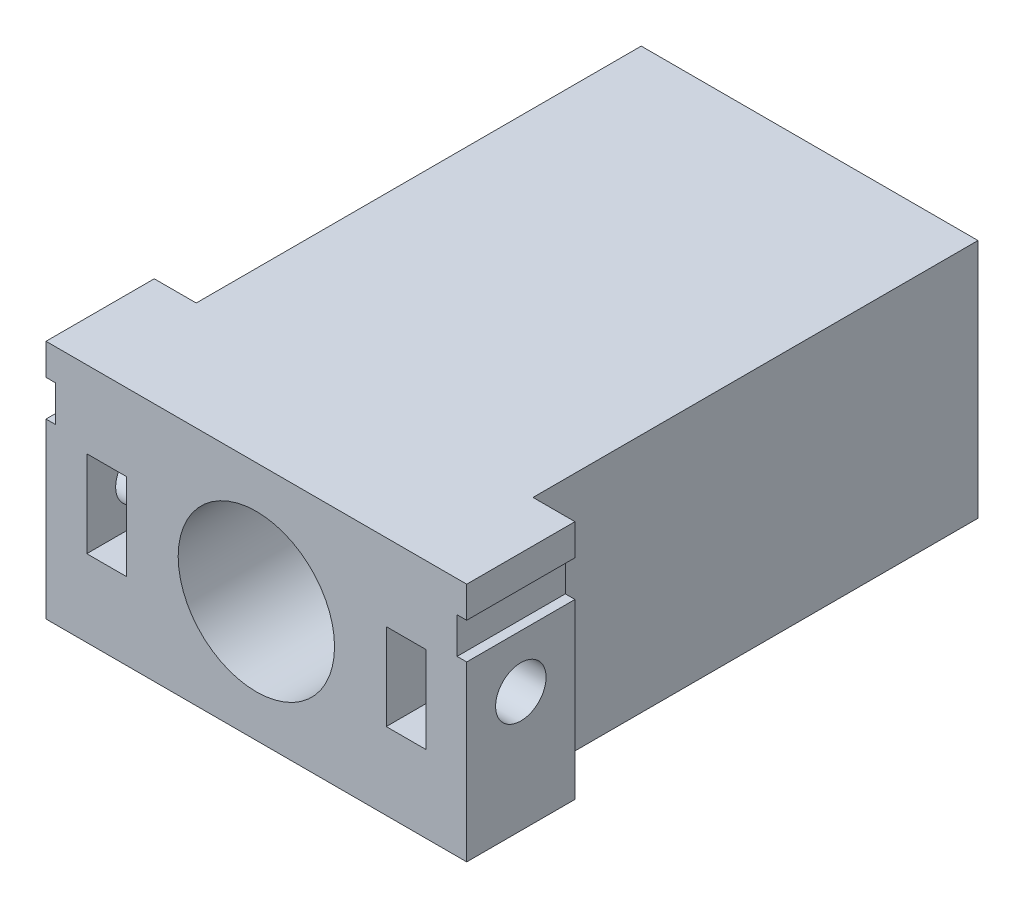
ISO-10303-21;
HEADER;
FILE_DESCRIPTION(('STEP AP214'),'2;1');
FILE_NAME('part.step','',(''),(''),'','','');
FILE_SCHEMA(('AUTOMOTIVE_DESIGN { 1 0 10303 214 1 1 1 1 }'));
ENDSEC;
DATA;
#1=APPLICATION_CONTEXT('core data for automotive mechanical design processes');
#2=APPLICATION_PROTOCOL_DEFINITION('international standard','automotive_design',2000,#1);
#3=PRODUCT_CONTEXT('',#1,'mechanical');
#4=PRODUCT('Part','Part','',(#3));
#5=PRODUCT_RELATED_PRODUCT_CATEGORY('part','',(#4));
#6=PRODUCT_DEFINITION_FORMATION('','',#4);
#7=PRODUCT_DEFINITION_CONTEXT('part definition',#1,'design');
#8=PRODUCT_DEFINITION('design','',#6,#7);
#9=PRODUCT_DEFINITION_SHAPE('','',#8);
#10=(LENGTH_UNIT() NAMED_UNIT(*) SI_UNIT(.MILLI.,.METRE.));
#11=(NAMED_UNIT(*) PLANE_ANGLE_UNIT() SI_UNIT($,.RADIAN.));
#12=(NAMED_UNIT(*) SI_UNIT($,.STERADIAN.) SOLID_ANGLE_UNIT());
#13=UNCERTAINTY_MEASURE_WITH_UNIT(LENGTH_MEASURE(1.E-05),#10,'distance_accuracy_value','');
#14=(GEOMETRIC_REPRESENTATION_CONTEXT(3) GLOBAL_UNCERTAINTY_ASSIGNED_CONTEXT((#13)) GLOBAL_UNIT_ASSIGNED_CONTEXT((#10,
#11,#12)) REPRESENTATION_CONTEXT('',''));
#15=CARTESIAN_POINT('',(0.,0.,0.));
#16=DIRECTION('',(0.,0.,1.));
#17=DIRECTION('',(1.,0.,0.));
#18=AXIS2_PLACEMENT_3D('',#15,#16,#17);
#19=CARTESIAN_POINT('',(0.,0.,46.));
#20=DIRECTION('',(0.,0.,1.));
#21=DIRECTION('',(1.,0.,0.));
#22=AXIS2_PLACEMENT_3D('',#19,#20,#21);
#23=PLANE('',#22);
#24=DIRECTION('',(0.,-1.,0.));
#25=VECTOR('',#24,1.);
#26=CARTESIAN_POINT('',(14.1,0.,46.));
#27=LINE('',#26,#25);
#28=CARTESIAN_POINT('',(14.1,3.60000000000001,46.));
#29=VERTEX_POINT('',#28);
#30=CARTESIAN_POINT('',(14.1,-3.60000000000001,46.));
#31=VERTEX_POINT('',#30);
#32=EDGE_CURVE('E271',#29,#31,#27,.T.);
#33=ORIENTED_EDGE('',*,*,#32,.T.);
#34=DIRECTION('',(1.,0.,0.));
#35=VECTOR('',#34,1.);
#36=CARTESIAN_POINT('',(10.8,-3.60000000000001,46.));
#37=LINE('',#36,#35);
#38=CARTESIAN_POINT('',(10.8,-3.60000000000001,46.));
#39=VERTEX_POINT('',#38);
#40=EDGE_CURVE('E390',#39,#31,#37,.T.);
#41=ORIENTED_EDGE('',*,*,#40,.F.);
#42=DIRECTION('',(0.,-1.,0.));
#43=VECTOR('',#42,1.);
#44=CARTESIAN_POINT('',(10.8,0.,46.));
#45=LINE('',#44,#43);
#46=CARTESIAN_POINT('',(10.8,3.60000000000001,46.));
#47=VERTEX_POINT('',#46);
#48=EDGE_CURVE('E376',#47,#39,#45,.T.);
#49=ORIENTED_EDGE('',*,*,#48,.F.);
#50=DIRECTION('',(1.,0.,0.));
#51=VECTOR('',#50,1.);
#52=CARTESIAN_POINT('',(10.8,3.60000000000001,46.));
#53=LINE('',#52,#51);
#54=EDGE_CURVE('E394',#47,#29,#53,.T.);
#55=ORIENTED_EDGE('',*,*,#54,.T.);
#56=EDGE_LOOP('',(#33,#41,#49,#55));
#57=FACE_BOUND('',#56,.T.);
#58=CARTESIAN_POINT('',(0.,0.,46.));
#59=DIRECTION('',(0.,0.,1.));
#60=DIRECTION('',(1.,0.,0.));
#61=AXIS2_PLACEMENT_3D('',#58,#59,#60);
#62=CIRCLE('',#61,6.5);
#63=CARTESIAN_POINT('',(6.5,0.,46.));
#64=VERTEX_POINT('',#63);
#65=EDGE_CURVE('E421',#64,#64,#62,.T.);
#66=ORIENTED_EDGE('',*,*,#65,.F.);
#67=EDGE_LOOP('',(#66));
#68=FACE_BOUND('',#67,.T.);
#69=DIRECTION('',(0.,1.,0.));
#70=VECTOR('',#69,1.);
#71=CARTESIAN_POINT('',(-14.1,0.,46.));
#72=LINE('',#71,#70);
#73=CARTESIAN_POINT('',(-14.1,-3.6,46.));
#74=VERTEX_POINT('',#73);
#75=CARTESIAN_POINT('',(-14.1,3.60000000000001,46.));
#76=VERTEX_POINT('',#75);
#77=EDGE_CURVE('E294',#74,#76,#72,.T.);
#78=ORIENTED_EDGE('',*,*,#77,.T.);
#79=DIRECTION('',(-1.,0.,0.));
#80=VECTOR('',#79,1.);
#81=CARTESIAN_POINT('',(-10.8,3.60000000000001,46.));
#82=LINE('',#81,#80);
#83=CARTESIAN_POINT('',(-10.8,3.60000000000001,46.));
#84=VERTEX_POINT('',#83);
#85=EDGE_CURVE('E355',#84,#76,#82,.T.);
#86=ORIENTED_EDGE('',*,*,#85,.F.);
#87=DIRECTION('',(0.,1.,0.));
#88=VECTOR('',#87,1.);
#89=CARTESIAN_POINT('',(-10.8,0.,46.));
#90=LINE('',#89,#88);
#91=CARTESIAN_POINT('',(-10.8,-3.6,46.));
#92=VERTEX_POINT('',#91);
#93=EDGE_CURVE('E330',#92,#84,#90,.T.);
#94=ORIENTED_EDGE('',*,*,#93,.F.);
#95=DIRECTION('',(-1.,0.,0.));
#96=VECTOR('',#95,1.);
#97=CARTESIAN_POINT('',(-10.8,-3.6,46.));
#98=LINE('',#97,#96);
#99=EDGE_CURVE('E358',#92,#74,#98,.T.);
#100=ORIENTED_EDGE('',*,*,#99,.T.);
#101=EDGE_LOOP('',(#78,#86,#94,#100));
#102=FACE_BOUND('',#101,.T.);
#103=DIRECTION('',(0.,-1.,0.));
#104=VECTOR('',#103,1.);
#105=CARTESIAN_POINT('',(16.69,0.,46.));
#106=LINE('',#105,#104);
#107=CARTESIAN_POINT('',(16.69,7.4,46.));
#108=VERTEX_POINT('',#107);
#109=CARTESIAN_POINT('',(16.69,4.4,46.));
#110=VERTEX_POINT('',#109);
#111=EDGE_CURVE('E234',#108,#110,#106,.T.);
#112=ORIENTED_EDGE('',*,*,#111,.F.);
#113=DIRECTION('',(1.,0.,0.));
#114=VECTOR('',#113,1.);
#115=CARTESIAN_POINT('',(16.69,7.4,46.));
#116=LINE('',#115,#114);
#117=CARTESIAN_POINT('',(17.49,7.4,46.));
#118=VERTEX_POINT('',#117);
#119=EDGE_CURVE('E217',#108,#118,#116,.T.);
#120=ORIENTED_EDGE('',*,*,#119,.T.);
#121=DIRECTION('',(0.,-1.,0.));
#122=VECTOR('',#121,1.);
#123=CARTESIAN_POINT('',(17.49,0.,46.));
#124=LINE('',#123,#122);
#125=CARTESIAN_POINT('',(17.49,10.,46.));
#126=VERTEX_POINT('',#125);
#127=EDGE_CURVE('E278',#126,#118,#124,.T.);
#128=ORIENTED_EDGE('',*,*,#127,.F.);
#129=DIRECTION('',(-1.,0.,0.));
#130=VECTOR('',#129,1.);
#131=CARTESIAN_POINT('',(14.,10.,46.));
#132=LINE('',#131,#130);
#133=CARTESIAN_POINT('',(-17.49,10.,46.));
#134=VERTEX_POINT('',#133);
#135=EDGE_CURVE('E430',#126,#134,#132,.T.);
#136=ORIENTED_EDGE('',*,*,#135,.T.);
#137=DIRECTION('',(0.,1.,0.));
#138=VECTOR('',#137,1.);
#139=CARTESIAN_POINT('',(-17.49,0.,46.));
#140=LINE('',#139,#138);
#141=CARTESIAN_POINT('',(-17.49,7.4,46.));
#142=VERTEX_POINT('',#141);
#143=EDGE_CURVE('E304',#142,#134,#140,.T.);
#144=ORIENTED_EDGE('',*,*,#143,.F.);
#145=DIRECTION('',(-1.,0.,0.));
#146=VECTOR('',#145,1.);
#147=CARTESIAN_POINT('',(-16.69,7.4,46.));
#148=LINE('',#147,#146);
#149=CARTESIAN_POINT('',(-16.69,7.4,46.));
#150=VERTEX_POINT('',#149);
#151=EDGE_CURVE('E69',#150,#142,#148,.T.);
#152=ORIENTED_EDGE('',*,*,#151,.F.);
#153=DIRECTION('',(0.,1.,0.));
#154=VECTOR('',#153,1.);
#155=CARTESIAN_POINT('',(-16.69,0.,46.));
#156=LINE('',#155,#154);
#157=CARTESIAN_POINT('',(-16.69,4.4,46.));
#158=VERTEX_POINT('',#157);
#159=EDGE_CURVE('E254',#158,#150,#156,.T.);
#160=ORIENTED_EDGE('',*,*,#159,.F.);
#161=DIRECTION('',(-1.,0.,0.));
#162=VECTOR('',#161,1.);
#163=CARTESIAN_POINT('',(-16.69,4.4,46.));
#164=LINE('',#163,#162);
#165=CARTESIAN_POINT('',(-17.49,4.4,46.));
#166=VERTEX_POINT('',#165);
#167=EDGE_CURVE('E268',#158,#166,#164,.T.);
#168=ORIENTED_EDGE('',*,*,#167,.T.);
#169=CARTESIAN_POINT('',(-17.49,-10.,46.));
#170=VERTEX_POINT('',#169);
#171=EDGE_CURVE('E300',#170,#166,#140,.T.);
#172=ORIENTED_EDGE('',*,*,#171,.F.);
#173=DIRECTION('',(1.,0.,0.));
#174=VECTOR('',#173,1.);
#175=CARTESIAN_POINT('',(14.,-10.,46.));
#176=LINE('',#175,#174);
#177=CARTESIAN_POINT('',(17.49,-10.,46.));
#178=VERTEX_POINT('',#177);
#179=EDGE_CURVE('E427',#170,#178,#176,.T.);
#180=ORIENTED_EDGE('',*,*,#179,.T.);
#181=CARTESIAN_POINT('',(17.49,4.4,46.));
#182=VERTEX_POINT('',#181);
#183=EDGE_CURVE('E281',#182,#178,#124,.T.);
#184=ORIENTED_EDGE('',*,*,#183,.F.);
#185=DIRECTION('',(1.,0.,0.));
#186=VECTOR('',#185,1.);
#187=CARTESIAN_POINT('',(16.69,4.4,46.));
#188=LINE('',#187,#186);
#189=EDGE_CURVE('E61',#110,#182,#188,.T.);
#190=ORIENTED_EDGE('',*,*,#189,.F.);
#191=EDGE_LOOP('',(#112,#120,#128,#136,#144,#152,#160,#168,#172,#180,#184,#190));
#192=FACE_BOUND('',#191,.T.);
#193=ADVANCED_FACE('F46',(#57,#68,#102,#192),#23,.T.);
#194=CARTESIAN_POINT('',(-2.56739074444562E-12,-19.0005555384098,36.999999999999));
#195=DIRECTION('',(0.,0.,-1.));
#196=DIRECTION('',(-1.,0.,0.));
#197=AXIS2_PLACEMENT_3D('',#194,#195,#196);
#198=PLANE('',#197);
#199=DIRECTION('',(0.,1.,0.));
#200=VECTOR('',#199,1.);
#201=CARTESIAN_POINT('',(17.49,0.,37.));
#202=LINE('',#201,#200);
#203=CARTESIAN_POINT('',(17.49,7.4,37.));
#204=VERTEX_POINT('',#203);
#205=CARTESIAN_POINT('',(17.49,10.,37.));
#206=VERTEX_POINT('',#205);
#207=EDGE_CURVE('E284',#204,#206,#202,.T.);
#208=ORIENTED_EDGE('',*,*,#207,.F.);
#209=DIRECTION('',(1.,0.,0.));
#210=VECTOR('',#209,1.);
#211=CARTESIAN_POINT('',(16.69,7.4,37.));
#212=LINE('',#211,#210);
#213=CARTESIAN_POINT('',(16.69,7.4,37.));
#214=VERTEX_POINT('',#213);
#215=EDGE_CURVE('E247',#214,#204,#212,.T.);
#216=ORIENTED_EDGE('',*,*,#215,.F.);
#217=DIRECTION('',(0.,1.,0.));
#218=VECTOR('',#217,1.);
#219=CARTESIAN_POINT('',(16.69,0.,37.));
#220=LINE('',#219,#218);
#221=CARTESIAN_POINT('',(16.69,4.4,37.));
#222=VERTEX_POINT('',#221);
#223=EDGE_CURVE('E228',#222,#214,#220,.T.);
#224=ORIENTED_EDGE('',*,*,#223,.F.);
#225=DIRECTION('',(1.,0.,0.));
#226=VECTOR('',#225,1.);
#227=CARTESIAN_POINT('',(16.69,4.4,37.));
#228=LINE('',#227,#226);
#229=CARTESIAN_POINT('',(17.49,4.4,37.));
#230=VERTEX_POINT('',#229);
#231=EDGE_CURVE('E250',#222,#230,#228,.T.);
#232=ORIENTED_EDGE('',*,*,#231,.T.);
#233=CARTESIAN_POINT('',(17.49,-10.,37.));
#234=VERTEX_POINT('',#233);
#235=EDGE_CURVE('E285',#234,#230,#202,.T.);
#236=ORIENTED_EDGE('',*,*,#235,.F.);
#237=DIRECTION('',(1.,0.,0.));
#238=VECTOR('',#237,1.);
#239=CARTESIAN_POINT('',(-2.56739074444562E-12,-10.,36.999999999999));
#240=LINE('',#239,#238);
#241=CARTESIAN_POINT('',(14.,-10.,37.));
#242=VERTEX_POINT('',#241);
#243=EDGE_CURVE('E410',#242,#234,#240,.T.);
#244=ORIENTED_EDGE('',*,*,#243,.F.);
#245=DIRECTION('',(0.,1.,0.));
#246=VECTOR('',#245,1.);
#247=CARTESIAN_POINT('',(14.,-19.0005555384098,37.));
#248=LINE('',#247,#246);
#249=CARTESIAN_POINT('',(14.,10.,37.));
#250=VERTEX_POINT('',#249);
#251=EDGE_CURVE('E407',#242,#250,#248,.T.);
#252=ORIENTED_EDGE('',*,*,#251,.T.);
#253=DIRECTION('',(-1.,0.,0.));
#254=VECTOR('',#253,1.);
#255=CARTESIAN_POINT('',(-2.56739074444562E-12,10.,36.999999999999));
#256=LINE('',#255,#254);
#257=EDGE_CURVE('E393',#206,#250,#256,.T.);
#258=ORIENTED_EDGE('',*,*,#257,.F.);
#259=EDGE_LOOP('',(#208,#216,#224,#232,#236,#244,#252,#258));
#260=FACE_BOUND('',#259,.T.);
#261=ADVANCED_FACE('F468',(#260),#198,.T.);
#262=CARTESIAN_POINT('',(17.49,0.,0.));
#263=DIRECTION('',(1.,0.,0.));
#264=DIRECTION('',(0.,0.,-1.));
#265=AXIS2_PLACEMENT_3D('',#262,#263,#264);
#266=PLANE('',#265);
#267=ORIENTED_EDGE('',*,*,#127,.T.);
#268=DIRECTION('',(0.,0.,-1.));
#269=VECTOR('',#268,1.);
#270=CARTESIAN_POINT('',(17.49,7.4,0.));
#271=LINE('',#270,#269);
#272=EDGE_CURVE('E223',#118,#204,#271,.T.);
#273=ORIENTED_EDGE('',*,*,#272,.T.);
#274=ORIENTED_EDGE('',*,*,#207,.T.);
#275=DIRECTION('',(0.,0.,1.));
#276=VECTOR('',#275,1.);
#277=CARTESIAN_POINT('',(17.49,10.,0.));
#278=LINE('',#277,#276);
#279=EDGE_CURVE('E288',#206,#126,#278,.T.);
#280=ORIENTED_EDGE('',*,*,#279,.T.);
#281=EDGE_LOOP('',(#267,#273,#274,#280));
#282=FACE_BOUND('',#281,.T.);
#283=ADVANCED_FACE('F498',(#282),#266,.T.);
#284=CARTESIAN_POINT('',(17.49,0.,41.5));
#285=DIRECTION('',(1.,0.,0.));
#286=DIRECTION('',(0.,0.,-1.));
#287=AXIS2_PLACEMENT_3D('',#284,#285,#286);
#288=CIRCLE('',#287,2.1);
#289=CARTESIAN_POINT('',(17.49,0.,39.4));
#290=VERTEX_POINT('',#289);
#291=EDGE_CURVE('E291',#290,#290,#288,.T.);
#292=ORIENTED_EDGE('',*,*,#291,.F.);
#293=EDGE_LOOP('',(#292));
#294=FACE_BOUND('',#293,.T.);
#295=ORIENTED_EDGE('',*,*,#235,.T.);
#296=DIRECTION('',(0.,0.,1.));
#297=VECTOR('',#296,1.);
#298=CARTESIAN_POINT('',(17.49,4.4,0.));
#299=LINE('',#298,#297);
#300=EDGE_CURVE('E237',#230,#182,#299,.T.);
#301=ORIENTED_EDGE('',*,*,#300,.T.);
#302=ORIENTED_EDGE('',*,*,#183,.T.);
#303=DIRECTION('',(0.,0.,-1.));
#304=VECTOR('',#303,1.);
#305=CARTESIAN_POINT('',(17.49,-10.,0.));
#306=LINE('',#305,#304);
#307=EDGE_CURVE('E280',#178,#234,#306,.T.);
#308=ORIENTED_EDGE('',*,*,#307,.T.);
#309=EDGE_LOOP('',(#295,#301,#302,#308));
#310=FACE_BOUND('',#309,.T.);
#311=ADVANCED_FACE('F472',(#294,#310),#266,.T.);
#312=CARTESIAN_POINT('',(-17.49,0.,0.));
#313=DIRECTION('',(-1.,0.,0.));
#314=DIRECTION('',(0.,0.,1.));
#315=AXIS2_PLACEMENT_3D('',#312,#313,#314);
#316=PLANE('',#315);
#317=DIRECTION('',(0.,0.,1.));
#318=VECTOR('',#317,1.);
#319=CARTESIAN_POINT('',(-17.49,4.4,0.));
#320=LINE('',#319,#318);
#321=CARTESIAN_POINT('',(-17.49,4.4,37.));
#322=VERTEX_POINT('',#321);
#323=EDGE_CURVE('E258',#322,#166,#320,.T.);
#324=ORIENTED_EDGE('',*,*,#323,.F.);
#325=DIRECTION('',(0.,-1.,0.));
#326=VECTOR('',#325,1.);
#327=CARTESIAN_POINT('',(-17.49,0.,37.));
#328=LINE('',#327,#326);
#329=CARTESIAN_POINT('',(-17.49,-10.,37.));
#330=VERTEX_POINT('',#329);
#331=EDGE_CURVE('E307',#322,#330,#328,.T.);
#332=ORIENTED_EDGE('',*,*,#331,.T.);
#333=DIRECTION('',(0.,0.,1.));
#334=VECTOR('',#333,1.);
#335=CARTESIAN_POINT('',(-17.49,-10.,0.));
#336=LINE('',#335,#334);
#337=EDGE_CURVE('E311',#330,#170,#336,.T.);
#338=ORIENTED_EDGE('',*,*,#337,.T.);
#339=ORIENTED_EDGE('',*,*,#171,.T.);
#340=EDGE_LOOP('',(#324,#332,#338,#339));
#341=FACE_BOUND('',#340,.T.);
#342=CARTESIAN_POINT('',(-17.49,0.,41.5));
#343=DIRECTION('',(-1.,0.,0.));
#344=DIRECTION('',(0.,0.,1.));
#345=AXIS2_PLACEMENT_3D('',#342,#343,#344);
#346=CIRCLE('',#345,2.1);
#347=CARTESIAN_POINT('',(-17.49,0.,43.6));
#348=VERTEX_POINT('',#347);
#349=EDGE_CURVE('E314',#348,#348,#346,.T.);
#350=ORIENTED_EDGE('',*,*,#349,.F.);
#351=EDGE_LOOP('',(#350));
#352=FACE_BOUND('',#351,.T.);
#353=ADVANCED_FACE('F477',(#341,#352),#316,.T.);
#354=CARTESIAN_POINT('',(14.,-10.,46.));
#355=DIRECTION('',(-1.,0.,0.));
#356=DIRECTION('',(0.,0.,1.));
#357=AXIS2_PLACEMENT_3D('',#354,#355,#356);
#358=PLANE('',#357);
#359=ORIENTED_EDGE('',*,*,#251,.F.);
#360=DIRECTION('',(0.,0.,-1.));
#361=VECTOR('',#360,1.);
#362=CARTESIAN_POINT('',(14.,-10.,46.));
#363=LINE('',#362,#361);
#364=CARTESIAN_POINT('',(14.,-10.,0.));
#365=VERTEX_POINT('',#364);
#366=EDGE_CURVE('E54',#242,#365,#363,.T.);
#367=ORIENTED_EDGE('',*,*,#366,.T.);
#368=DIRECTION('',(0.,1.,0.));
#369=VECTOR('',#368,1.);
#370=CARTESIAN_POINT('',(14.,-10.,0.));
#371=LINE('',#370,#369);
#372=CARTESIAN_POINT('',(14.,10.,0.));
#373=VERTEX_POINT('',#372);
#374=EDGE_CURVE('E440',#365,#373,#371,.T.);
#375=ORIENTED_EDGE('',*,*,#374,.T.);
#376=DIRECTION('',(0.,0.,-1.));
#377=VECTOR('',#376,1.);
#378=CARTESIAN_POINT('',(14.,10.,46.));
#379=LINE('',#378,#377);
#380=EDGE_CURVE('E446',#250,#373,#379,.T.);
#381=ORIENTED_EDGE('',*,*,#380,.F.);
#382=EDGE_LOOP('',(#359,#367,#375,#381));
#383=FACE_BOUND('',#382,.T.);
#384=ADVANCED_FACE('F449',(#383),#358,.F.);
#385=CARTESIAN_POINT('',(0.,0.,0.));
#386=DIRECTION('',(0.,0.,1.));
#387=DIRECTION('',(1.,0.,0.));
#388=AXIS2_PLACEMENT_3D('',#385,#386,#387);
#389=PLANE('',#388);
#390=DIRECTION('',(0.,-1.,0.));
#391=VECTOR('',#390,1.);
#392=CARTESIAN_POINT('',(-14.,-10.,0.));
#393=LINE('',#392,#391);
#394=CARTESIAN_POINT('',(-14.,10.,0.));
#395=VERTEX_POINT('',#394);
#396=CARTESIAN_POINT('',(-14.,-10.,0.));
#397=VERTEX_POINT('',#396);
#398=EDGE_CURVE('E424',#395,#397,#393,.T.);
#399=ORIENTED_EDGE('',*,*,#398,.F.);
#400=DIRECTION('',(-1.,0.,0.));
#401=VECTOR('',#400,1.);
#402=CARTESIAN_POINT('',(14.,10.,0.));
#403=LINE('',#402,#401);
#404=EDGE_CURVE('E431',#373,#395,#403,.T.);
#405=ORIENTED_EDGE('',*,*,#404,.F.);
#406=ORIENTED_EDGE('',*,*,#374,.F.);
#407=DIRECTION('',(1.,0.,0.));
#408=VECTOR('',#407,1.);
#409=CARTESIAN_POINT('',(14.,-10.,0.));
#410=LINE('',#409,#408);
#411=EDGE_CURVE('E437',#397,#365,#410,.T.);
#412=ORIENTED_EDGE('',*,*,#411,.F.);
#413=EDGE_LOOP('',(#399,#405,#406,#412));
#414=FACE_BOUND('',#413,.T.);
#415=CARTESIAN_POINT('',(0.,0.,0.));
#416=DIRECTION('',(0.,0.,1.));
#417=DIRECTION('',(1.,0.,0.));
#418=AXIS2_PLACEMENT_3D('',#415,#416,#417);
#419=CIRCLE('',#418,6.5);
#420=CARTESIAN_POINT('',(6.5,0.,0.));
#421=VERTEX_POINT('',#420);
#422=EDGE_CURVE('E416',#421,#421,#419,.T.);
#423=ORIENTED_EDGE('',*,*,#422,.T.);
#424=EDGE_LOOP('',(#423));
#425=FACE_BOUND('',#424,.T.);
#426=ADVANCED_FACE('F459',(#414,#425),#389,.F.);
#427=CARTESIAN_POINT('',(-14.,-10.,46.));
#428=DIRECTION('',(1.,0.,0.));
#429=DIRECTION('',(0.,0.,-1.));
#430=AXIS2_PLACEMENT_3D('',#427,#428,#429);
#431=PLANE('',#430);
#432=DIRECTION('',(0.,0.,-1.));
#433=VECTOR('',#432,1.);
#434=CARTESIAN_POINT('',(-14.,-10.,46.));
#435=LINE('',#434,#433);
#436=CARTESIAN_POINT('',(-14.,-10.,37.));
#437=VERTEX_POINT('',#436);
#438=EDGE_CURVE('E11',#437,#397,#435,.T.);
#439=ORIENTED_EDGE('',*,*,#438,.F.);
#440=DIRECTION('',(0.,1.,0.));
#441=VECTOR('',#440,1.);
#442=CARTESIAN_POINT('',(-14.,-19.0005555384098,37.));
#443=LINE('',#442,#441);
#444=CARTESIAN_POINT('',(-14.,10.,37.));
#445=VERTEX_POINT('',#444);
#446=EDGE_CURVE('E417',#437,#445,#443,.T.);
#447=ORIENTED_EDGE('',*,*,#446,.T.);
#448=DIRECTION('',(0.,0.,-1.));
#449=VECTOR('',#448,1.);
#450=CARTESIAN_POINT('',(-14.,10.,46.));
#451=LINE('',#450,#449);
#452=EDGE_CURVE('E434',#445,#395,#451,.T.);
#453=ORIENTED_EDGE('',*,*,#452,.T.);
#454=ORIENTED_EDGE('',*,*,#398,.T.);
#455=EDGE_LOOP('',(#439,#447,#453,#454));
#456=FACE_BOUND('',#455,.T.);
#457=ADVANCED_FACE('F48',(#456),#431,.F.);
#458=CARTESIAN_POINT('',(14.,-10.,46.));
#459=DIRECTION('',(0.,1.,0.));
#460=DIRECTION('',(0.,0.,1.));
#461=AXIS2_PLACEMENT_3D('',#458,#459,#460);
#462=PLANE('',#461);
#463=ORIENTED_EDGE('',*,*,#411,.T.);
#464=ORIENTED_EDGE('',*,*,#366,.F.);
#465=ORIENTED_EDGE('',*,*,#243,.T.);
#466=ORIENTED_EDGE('',*,*,#307,.F.);
#467=ORIENTED_EDGE('',*,*,#179,.F.);
#468=ORIENTED_EDGE('',*,*,#337,.F.);
#469=DIRECTION('',(-1.,0.,0.));
#470=VECTOR('',#469,1.);
#471=CARTESIAN_POINT('',(2.56739074444562E-12,-10.,36.999999999999));
#472=LINE('',#471,#470);
#473=EDGE_CURVE('E413',#437,#330,#472,.T.);
#474=ORIENTED_EDGE('',*,*,#473,.F.);
#475=ORIENTED_EDGE('',*,*,#438,.T.);
#476=EDGE_LOOP('',(#463,#464,#465,#466,#467,#468,#474,#475));
#477=FACE_BOUND('',#476,.T.);
#478=ADVANCED_FACE('F455',(#477),#462,.F.);
#479=CARTESIAN_POINT('',(14.,10.,46.));
#480=DIRECTION('',(0.,-1.,0.));
#481=DIRECTION('',(0.,0.,-1.));
#482=AXIS2_PLACEMENT_3D('',#479,#480,#481);
#483=PLANE('',#482);
#484=ORIENTED_EDGE('',*,*,#404,.T.);
#485=ORIENTED_EDGE('',*,*,#452,.F.);
#486=DIRECTION('',(1.,0.,0.));
#487=VECTOR('',#486,1.);
#488=CARTESIAN_POINT('',(2.56739074444562E-12,10.,36.999999999999));
#489=LINE('',#488,#487);
#490=CARTESIAN_POINT('',(-17.49,10.,37.));
#491=VERTEX_POINT('',#490);
#492=EDGE_CURVE('E412',#491,#445,#489,.T.);
#493=ORIENTED_EDGE('',*,*,#492,.F.);
#494=DIRECTION('',(0.,0.,-1.));
#495=VECTOR('',#494,1.);
#496=CARTESIAN_POINT('',(-17.49,10.,0.));
#497=LINE('',#496,#495);
#498=EDGE_CURVE('E303',#134,#491,#497,.T.);
#499=ORIENTED_EDGE('',*,*,#498,.F.);
#500=ORIENTED_EDGE('',*,*,#135,.F.);
#501=ORIENTED_EDGE('',*,*,#279,.F.);
#502=ORIENTED_EDGE('',*,*,#257,.T.);
#503=ORIENTED_EDGE('',*,*,#380,.T.);
#504=EDGE_LOOP('',(#484,#485,#493,#499,#500,#501,#502,#503));
#505=FACE_BOUND('',#504,.T.);
#506=ADVANCED_FACE('F463',(#505),#483,.F.);
#507=CARTESIAN_POINT('',(0.,0.,46.));
#508=DIRECTION('',(0.,0.,-1.));
#509=DIRECTION('',(-1.,0.,0.));
#510=AXIS2_PLACEMENT_3D('',#507,#508,#509);
#511=CYLINDRICAL_SURFACE('',#510,6.5);
#512=ORIENTED_EDGE('',*,*,#65,.T.);
#513=EDGE_LOOP('',(#512));
#514=FACE_BOUND('',#513,.T.);
#515=ORIENTED_EDGE('',*,*,#422,.F.);
#516=EDGE_LOOP('',(#515));
#517=FACE_BOUND('',#516,.T.);
#518=ADVANCED_FACE('F502',(#514,#517),#511,.F.);
#519=CARTESIAN_POINT('',(2.56739074444562E-12,-19.0005555384098,36.999999999999));
#520=DIRECTION('',(0.,0.,1.));
#521=DIRECTION('',(1.,0.,0.));
#522=AXIS2_PLACEMENT_3D('',#519,#520,#521);
#523=PLANE('',#522);
#524=ORIENTED_EDGE('',*,*,#331,.F.);
#525=DIRECTION('',(-1.,0.,0.));
#526=VECTOR('',#525,1.);
#527=CARTESIAN_POINT('',(-16.69,4.4,37.));
#528=LINE('',#527,#526);
#529=CARTESIAN_POINT('',(-16.69,4.4,37.));
#530=VERTEX_POINT('',#529);
#531=EDGE_CURVE('E272',#530,#322,#528,.T.);
#532=ORIENTED_EDGE('',*,*,#531,.F.);
#533=DIRECTION('',(0.,-1.,0.));
#534=VECTOR('',#533,1.);
#535=CARTESIAN_POINT('',(-16.69,0.,37.));
#536=LINE('',#535,#534);
#537=CARTESIAN_POINT('',(-16.69,7.4,37.));
#538=VERTEX_POINT('',#537);
#539=EDGE_CURVE('E261',#538,#530,#536,.T.);
#540=ORIENTED_EDGE('',*,*,#539,.F.);
#541=DIRECTION('',(-1.,0.,0.));
#542=VECTOR('',#541,1.);
#543=CARTESIAN_POINT('',(-16.69,7.4,37.));
#544=LINE('',#543,#542);
#545=CARTESIAN_POINT('',(-17.49,7.4,37.));
#546=VERTEX_POINT('',#545);
#547=EDGE_CURVE('E274',#538,#546,#544,.T.);
#548=ORIENTED_EDGE('',*,*,#547,.T.);
#549=EDGE_CURVE('E308',#491,#546,#328,.T.);
#550=ORIENTED_EDGE('',*,*,#549,.F.);
#551=ORIENTED_EDGE('',*,*,#492,.T.);
#552=ORIENTED_EDGE('',*,*,#446,.F.);
#553=ORIENTED_EDGE('',*,*,#473,.T.);
#554=EDGE_LOOP('',(#524,#532,#540,#548,#550,#551,#552,#553));
#555=FACE_BOUND('',#554,.T.);
#556=ADVANCED_FACE('F483',(#555),#523,.F.);
#557=CARTESIAN_POINT('',(10.8,-3.60000000000001,0.));
#558=DIRECTION('',(0.,-1.,0.));
#559=DIRECTION('',(0.,0.,-1.));
#560=AXIS2_PLACEMENT_3D('',#557,#558,#559);
#561=PLANE('',#560);
#562=DIRECTION('',(0.,0.,-1.));
#563=VECTOR('',#562,1.);
#564=CARTESIAN_POINT('',(14.1,-3.60000000000001,0.));
#565=LINE('',#564,#563);
#566=CARTESIAN_POINT('',(14.1,-3.60000000000001,39.4215390309174));
#567=VERTEX_POINT('',#566);
#568=EDGE_CURVE('E351',#31,#567,#565,.T.);
#569=ORIENTED_EDGE('',*,*,#568,.T.);
#570=DIRECTION('',(1.,0.,0.));
#571=VECTOR('',#570,1.);
#572=CARTESIAN_POINT('',(10.8,-3.60000000000001,39.4215390309173));
#573=LINE('',#572,#571);
#574=CARTESIAN_POINT('',(10.8,-3.60000000000001,39.4215390309173));
#575=VERTEX_POINT('',#574);
#576=EDGE_CURVE('E379',#575,#567,#573,.T.);
#577=ORIENTED_EDGE('',*,*,#576,.F.);
#578=DIRECTION('',(0.,0.,-1.));
#579=VECTOR('',#578,1.);
#580=CARTESIAN_POINT('',(10.8,-3.60000000000001,0.));
#581=LINE('',#580,#579);
#582=EDGE_CURVE('E363',#39,#575,#581,.T.);
#583=ORIENTED_EDGE('',*,*,#582,.F.);
#584=ORIENTED_EDGE('',*,*,#40,.T.);
#585=EDGE_LOOP('',(#569,#577,#583,#584));
#586=FACE_BOUND('',#585,.T.);
#587=ADVANCED_FACE('F596',(#586),#561,.F.);
#588=CARTESIAN_POINT('',(10.8,3.60000000000001,0.));
#589=DIRECTION('',(0.,1.,0.));
#590=DIRECTION('',(0.,0.,1.));
#591=AXIS2_PLACEMENT_3D('',#588,#589,#590);
#592=PLANE('',#591);
#593=DIRECTION('',(0.,0.,1.));
#594=VECTOR('',#593,1.);
#595=CARTESIAN_POINT('',(14.1,3.60000000000001,0.));
#596=LINE('',#595,#594);
#597=CARTESIAN_POINT('',(14.1,3.60000000000001,39.4215390309174));
#598=VERTEX_POINT('',#597);
#599=EDGE_CURVE('E367',#598,#29,#596,.T.);
#600=ORIENTED_EDGE('',*,*,#599,.T.);
#601=ORIENTED_EDGE('',*,*,#54,.F.);
#602=DIRECTION('',(0.,0.,1.));
#603=VECTOR('',#602,1.);
#604=CARTESIAN_POINT('',(10.8,3.60000000000001,0.));
#605=LINE('',#604,#603);
#606=CARTESIAN_POINT('',(10.8,3.60000000000001,39.4215390309174));
#607=VERTEX_POINT('',#606);
#608=EDGE_CURVE('E373',#607,#47,#605,.T.);
#609=ORIENTED_EDGE('',*,*,#608,.F.);
#610=DIRECTION('',(1.,0.,0.));
#611=VECTOR('',#610,1.);
#612=CARTESIAN_POINT('',(10.8,3.60000000000001,39.4215390309174));
#613=LINE('',#612,#611);
#614=EDGE_CURVE('E397',#607,#598,#613,.T.);
#615=ORIENTED_EDGE('',*,*,#614,.T.);
#616=EDGE_LOOP('',(#600,#601,#609,#615));
#617=FACE_BOUND('',#616,.T.);
#618=ADVANCED_FACE('F644',(#617),#592,.F.);
#619=CARTESIAN_POINT('',(10.8,-16.1700271285271,28.007308546376));
#620=DIRECTION('',(0.,0.5,-0.866025403784439));
#621=DIRECTION('',(0.,0.866025403784439,0.5));
#622=AXIS2_PLACEMENT_3D('',#619,#620,#621);
#623=PLANE('',#622);
#624=DIRECTION('',(0.,0.866025403784439,0.5));
#625=VECTOR('',#624,1.);
#626=CARTESIAN_POINT('',(14.1,-16.1700271285271,28.007308546376));
#627=LINE('',#626,#625);
#628=CARTESIAN_POINT('',(14.1,0.,37.3430780618347));
#629=VERTEX_POINT('',#628);
#630=EDGE_CURVE('E385',#629,#598,#627,.T.);
#631=ORIENTED_EDGE('',*,*,#630,.T.);
#632=ORIENTED_EDGE('',*,*,#614,.F.);
#633=DIRECTION('',(0.,0.866025403784439,0.5));
#634=VECTOR('',#633,1.);
#635=CARTESIAN_POINT('',(10.8,-16.1700271285271,28.007308546376));
#636=LINE('',#635,#634);
#637=CARTESIAN_POINT('',(10.8,0.,37.3430780618347));
#638=VERTEX_POINT('',#637);
#639=EDGE_CURVE('E370',#638,#607,#636,.T.);
#640=ORIENTED_EDGE('',*,*,#639,.F.);
#641=DIRECTION('',(1.,0.,0.));
#642=VECTOR('',#641,1.);
#643=CARTESIAN_POINT('',(10.8,0.,37.3430780618347));
#644=LINE('',#643,#642);
#645=EDGE_CURVE('E400',#638,#629,#644,.T.);
#646=ORIENTED_EDGE('',*,*,#645,.T.);
#647=EDGE_LOOP('',(#631,#632,#640,#646));
#648=FACE_BOUND('',#647,.T.);
#649=ADVANCED_FACE('F631',(#648),#623,.F.);
#650=CARTESIAN_POINT('',(10.8,16.1700271285271,28.0073085463761));
#651=DIRECTION('',(0.,-0.499999999999999,-0.866025403784439));
#652=DIRECTION('',(0.,0.866025403784439,-0.499999999999999));
#653=AXIS2_PLACEMENT_3D('',#650,#651,#652);
#654=PLANE('',#653);
#655=DIRECTION('',(0.,0.866025403784439,-0.499999999999999));
#656=VECTOR('',#655,1.);
#657=CARTESIAN_POINT('',(14.1,16.1700271285271,28.0073085463761));
#658=LINE('',#657,#656);
#659=EDGE_CURVE('E382',#567,#629,#658,.T.);
#660=ORIENTED_EDGE('',*,*,#659,.T.);
#661=ORIENTED_EDGE('',*,*,#645,.F.);
#662=DIRECTION('',(0.,0.866025403784439,-0.499999999999999));
#663=VECTOR('',#662,1.);
#664=CARTESIAN_POINT('',(10.8,16.1700271285271,28.0073085463761));
#665=LINE('',#664,#663);
#666=EDGE_CURVE('E366',#575,#638,#665,.T.);
#667=ORIENTED_EDGE('',*,*,#666,.F.);
#668=ORIENTED_EDGE('',*,*,#576,.T.);
#669=EDGE_LOOP('',(#660,#661,#667,#668));
#670=FACE_BOUND('',#669,.T.);
#671=ADVANCED_FACE('F625',(#670),#654,.F.);
#672=CARTESIAN_POINT('',(10.8,0.,0.));
#673=DIRECTION('',(1.,0.,0.));
#674=DIRECTION('',(0.,0.,-1.));
#675=AXIS2_PLACEMENT_3D('',#672,#673,#674);
#676=PLANE('',#675);
#677=ORIENTED_EDGE('',*,*,#582,.T.);
#678=ORIENTED_EDGE('',*,*,#666,.T.);
#679=ORIENTED_EDGE('',*,*,#639,.T.);
#680=ORIENTED_EDGE('',*,*,#608,.T.);
#681=ORIENTED_EDGE('',*,*,#48,.T.);
#682=EDGE_LOOP('',(#677,#678,#679,#680,#681));
#683=FACE_BOUND('',#682,.T.);
#684=ADVANCED_FACE('F630',(#683),#676,.T.);
#685=CARTESIAN_POINT('',(-10.8,16.1700271285271,28.007308546376));
#686=DIRECTION('',(0.,-0.5,-0.866025403784439));
#687=DIRECTION('',(0.,0.866025403784439,-0.5));
#688=AXIS2_PLACEMENT_3D('',#685,#686,#687);
#689=PLANE('',#688);
#690=DIRECTION('',(0.,-0.866025403784439,0.5));
#691=VECTOR('',#690,1.);
#692=CARTESIAN_POINT('',(-14.1,16.1700271285271,28.007308546376));
#693=LINE('',#692,#691);
#694=CARTESIAN_POINT('',(-14.1,0.,37.3430780618347));
#695=VERTEX_POINT('',#694);
#696=CARTESIAN_POINT('',(-14.1,-3.6,39.4215390309173));
#697=VERTEX_POINT('',#696);
#698=EDGE_CURVE('E317',#695,#697,#693,.T.);
#699=ORIENTED_EDGE('',*,*,#698,.T.);
#700=DIRECTION('',(-1.,0.,0.));
#701=VECTOR('',#700,1.);
#702=CARTESIAN_POINT('',(-10.8,-3.6,39.4215390309173));
#703=LINE('',#702,#701);
#704=CARTESIAN_POINT('',(-10.8,-3.6,39.4215390309173));
#705=VERTEX_POINT('',#704);
#706=EDGE_CURVE('E338',#705,#697,#703,.T.);
#707=ORIENTED_EDGE('',*,*,#706,.F.);
#708=DIRECTION('',(0.,-0.866025403784439,0.5));
#709=VECTOR('',#708,1.);
#710=CARTESIAN_POINT('',(-10.8,16.1700271285271,28.007308546376));
#711=LINE('',#710,#709);
#712=CARTESIAN_POINT('',(-10.8,0.,37.3430780618347));
#713=VERTEX_POINT('',#712);
#714=EDGE_CURVE('E323',#713,#705,#711,.T.);
#715=ORIENTED_EDGE('',*,*,#714,.F.);
#716=DIRECTION('',(-1.,0.,0.));
#717=VECTOR('',#716,1.);
#718=CARTESIAN_POINT('',(-10.8,0.,37.3430780618347));
#719=LINE('',#718,#717);
#720=EDGE_CURVE('E348',#713,#695,#719,.T.);
#721=ORIENTED_EDGE('',*,*,#720,.T.);
#722=EDGE_LOOP('',(#699,#707,#715,#721));
#723=FACE_BOUND('',#722,.T.);
#724=ADVANCED_FACE('F729',(#723),#689,.F.);
#725=CARTESIAN_POINT('',(-10.8,-16.1700271285271,28.007308546376));
#726=DIRECTION('',(0.,0.5,-0.866025403784438));
#727=DIRECTION('',(0.,0.866025403784438,0.5));
#728=AXIS2_PLACEMENT_3D('',#725,#726,#727);
#729=PLANE('',#728);
#730=DIRECTION('',(0.,-0.866025403784439,-0.5));
#731=VECTOR('',#730,1.);
#732=CARTESIAN_POINT('',(-14.1,-16.1700271285271,28.007308546376));
#733=LINE('',#732,#731);
#734=CARTESIAN_POINT('',(-14.1,3.60000000000001,39.4215390309174));
#735=VERTEX_POINT('',#734);
#736=EDGE_CURVE('E327',#735,#695,#733,.T.);
#737=ORIENTED_EDGE('',*,*,#736,.T.);
#738=ORIENTED_EDGE('',*,*,#720,.F.);
#739=DIRECTION('',(0.,-0.866025403784439,-0.5));
#740=VECTOR('',#739,1.);
#741=CARTESIAN_POINT('',(-10.8,-16.1700271285271,28.007308546376));
#742=LINE('',#741,#740);
#743=CARTESIAN_POINT('',(-10.8,3.60000000000001,39.4215390309174));
#744=VERTEX_POINT('',#743);
#745=EDGE_CURVE('E335',#744,#713,#742,.T.);
#746=ORIENTED_EDGE('',*,*,#745,.F.);
#747=DIRECTION('',(-1.,0.,0.));
#748=VECTOR('',#747,1.);
#749=CARTESIAN_POINT('',(-10.8,3.60000000000001,39.4215390309174));
#750=LINE('',#749,#748);
#751=EDGE_CURVE('E352',#744,#735,#750,.T.);
#752=ORIENTED_EDGE('',*,*,#751,.T.);
#753=EDGE_LOOP('',(#737,#738,#746,#752));
#754=FACE_BOUND('',#753,.T.);
#755=ADVANCED_FACE('F718',(#754),#729,.F.);
#756=CARTESIAN_POINT('',(-10.8,3.6,0.));
#757=DIRECTION('',(0.,-1.,0.));
#758=DIRECTION('',(0.,0.,-1.));
#759=AXIS2_PLACEMENT_3D('',#756,#757,#758);
#760=PLANE('',#759);
#761=DIRECTION('',(0.,0.,1.));
#762=VECTOR('',#761,1.);
#763=CARTESIAN_POINT('',(-14.1,3.6,0.));
#764=LINE('',#763,#762);
#765=EDGE_CURVE('E344',#735,#76,#764,.T.);
#766=ORIENTED_EDGE('',*,*,#765,.F.);
#767=ORIENTED_EDGE('',*,*,#751,.F.);
#768=DIRECTION('',(0.,0.,1.));
#769=VECTOR('',#768,1.);
#770=CARTESIAN_POINT('',(-10.8,3.6,0.));
#771=LINE('',#770,#769);
#772=EDGE_CURVE('E333',#744,#84,#771,.T.);
#773=ORIENTED_EDGE('',*,*,#772,.T.);
#774=ORIENTED_EDGE('',*,*,#85,.T.);
#775=EDGE_LOOP('',(#766,#767,#773,#774));
#776=FACE_BOUND('',#775,.T.);
#777=ADVANCED_FACE('F706',(#776),#760,.T.);
#778=CARTESIAN_POINT('',(-10.8,-3.6,0.));
#779=DIRECTION('',(0.,-1.,0.));
#780=DIRECTION('',(0.,0.,-1.));
#781=AXIS2_PLACEMENT_3D('',#778,#779,#780);
#782=PLANE('',#781);
#783=DIRECTION('',(0.,0.,1.));
#784=VECTOR('',#783,1.);
#785=CARTESIAN_POINT('',(-14.1,-3.6,0.));
#786=LINE('',#785,#784);
#787=EDGE_CURVE('E341',#697,#74,#786,.T.);
#788=ORIENTED_EDGE('',*,*,#787,.T.);
#789=ORIENTED_EDGE('',*,*,#99,.F.);
#790=DIRECTION('',(0.,0.,1.));
#791=VECTOR('',#790,1.);
#792=CARTESIAN_POINT('',(-10.8,-3.6,0.));
#793=LINE('',#792,#791);
#794=EDGE_CURVE('E326',#705,#92,#793,.T.);
#795=ORIENTED_EDGE('',*,*,#794,.F.);
#796=ORIENTED_EDGE('',*,*,#706,.T.);
#797=EDGE_LOOP('',(#788,#789,#795,#796));
#798=FACE_BOUND('',#797,.T.);
#799=ADVANCED_FACE('F701',(#798),#782,.F.);
#800=CARTESIAN_POINT('',(-10.8,0.,0.));
#801=DIRECTION('',(-1.,0.,0.));
#802=DIRECTION('',(0.,0.,1.));
#803=AXIS2_PLACEMENT_3D('',#800,#801,#802);
#804=PLANE('',#803);
#805=ORIENTED_EDGE('',*,*,#714,.T.);
#806=ORIENTED_EDGE('',*,*,#794,.T.);
#807=ORIENTED_EDGE('',*,*,#93,.T.);
#808=ORIENTED_EDGE('',*,*,#772,.F.);
#809=ORIENTED_EDGE('',*,*,#745,.T.);
#810=EDGE_LOOP('',(#805,#806,#807,#808,#809));
#811=FACE_BOUND('',#810,.T.);
#812=ADVANCED_FACE('F694',(#811),#804,.T.);
#813=CARTESIAN_POINT('',(-14.1,0.,0.));
#814=DIRECTION('',(-1.,0.,0.));
#815=DIRECTION('',(0.,0.,1.));
#816=AXIS2_PLACEMENT_3D('',#813,#814,#815);
#817=PLANE('',#816);
#818=CARTESIAN_POINT('',(-14.1,0.,41.5));
#819=DIRECTION('',(-1.,0.,0.));
#820=DIRECTION('',(0.,0.,1.));
#821=AXIS2_PLACEMENT_3D('',#818,#819,#820);
#822=CIRCLE('',#821,2.1);
#823=CARTESIAN_POINT('',(-14.1,0.,43.6));
#824=VERTEX_POINT('',#823);
#825=EDGE_CURVE('E320',#824,#824,#822,.T.);
#826=ORIENTED_EDGE('',*,*,#825,.T.);
#827=EDGE_LOOP('',(#826));
#828=FACE_BOUND('',#827,.T.);
#829=ORIENTED_EDGE('',*,*,#736,.F.);
#830=ORIENTED_EDGE('',*,*,#765,.T.);
#831=ORIENTED_EDGE('',*,*,#77,.F.);
#832=ORIENTED_EDGE('',*,*,#787,.F.);
#833=ORIENTED_EDGE('',*,*,#698,.F.);
#834=EDGE_LOOP('',(#829,#830,#831,#832,#833));
#835=FACE_BOUND('',#834,.T.);
#836=ADVANCED_FACE('F530',(#828,#835),#817,.F.);
#837=CARTESIAN_POINT('',(-17.49,0.,41.5));
#838=DIRECTION('',(1.,0.,0.));
#839=DIRECTION('',(0.,0.,-1.));
#840=AXIS2_PLACEMENT_3D('',#837,#838,#839);
#841=CYLINDRICAL_SURFACE('',#840,2.1);
#842=ORIENTED_EDGE('',*,*,#349,.T.);
#843=EDGE_LOOP('',(#842));
#844=FACE_BOUND('',#843,.T.);
#845=ORIENTED_EDGE('',*,*,#825,.F.);
#846=EDGE_LOOP('',(#845));
#847=FACE_BOUND('',#846,.T.);
#848=ADVANCED_FACE('F522',(#844,#847),#841,.F.);
#849=DIRECTION('',(0.,0.,-1.));
#850=VECTOR('',#849,1.);
#851=CARTESIAN_POINT('',(-17.49,7.4,0.));
#852=LINE('',#851,#850);
#853=EDGE_CURVE('E249',#142,#546,#852,.T.);
#854=ORIENTED_EDGE('',*,*,#853,.F.);
#855=ORIENTED_EDGE('',*,*,#143,.T.);
#856=ORIENTED_EDGE('',*,*,#498,.T.);
#857=ORIENTED_EDGE('',*,*,#549,.T.);
#858=EDGE_LOOP('',(#854,#855,#856,#857));
#859=FACE_BOUND('',#858,.T.);
#860=ADVANCED_FACE('F512',(#859),#316,.T.);
#861=CARTESIAN_POINT('',(17.49,0.,41.5));
#862=DIRECTION('',(-1.,0.,0.));
#863=DIRECTION('',(0.,0.,1.));
#864=AXIS2_PLACEMENT_3D('',#861,#862,#863);
#865=CYLINDRICAL_SURFACE('',#864,2.1);
#866=ORIENTED_EDGE('',*,*,#291,.T.);
#867=EDGE_LOOP('',(#866));
#868=FACE_BOUND('',#867,.T.);
#869=CARTESIAN_POINT('',(14.1,0.,41.5));
#870=DIRECTION('',(1.,0.,0.));
#871=DIRECTION('',(0.,0.,-1.));
#872=AXIS2_PLACEMENT_3D('',#869,#870,#871);
#873=CIRCLE('',#872,2.1);
#874=CARTESIAN_POINT('',(14.1,0.,39.4));
#875=VERTEX_POINT('',#874);
#876=EDGE_CURVE('E297',#875,#875,#873,.T.);
#877=ORIENTED_EDGE('',*,*,#876,.F.);
#878=EDGE_LOOP('',(#877));
#879=FACE_BOUND('',#878,.T.);
#880=ADVANCED_FACE('F521',(#868,#879),#865,.F.);
#881=CARTESIAN_POINT('',(14.1,0.,0.));
#882=DIRECTION('',(1.,0.,0.));
#883=DIRECTION('',(0.,0.,-1.));
#884=AXIS2_PLACEMENT_3D('',#881,#882,#883);
#885=PLANE('',#884);
#886=ORIENTED_EDGE('',*,*,#568,.F.);
#887=ORIENTED_EDGE('',*,*,#32,.F.);
#888=ORIENTED_EDGE('',*,*,#599,.F.);
#889=ORIENTED_EDGE('',*,*,#630,.F.);
#890=ORIENTED_EDGE('',*,*,#659,.F.);
#891=EDGE_LOOP('',(#886,#887,#888,#889,#890));
#892=FACE_BOUND('',#891,.T.);
#893=ORIENTED_EDGE('',*,*,#876,.T.);
#894=EDGE_LOOP('',(#893));
#895=FACE_BOUND('',#894,.T.);
#896=ADVANCED_FACE('F528',(#892,#895),#885,.F.);
#897=CARTESIAN_POINT('',(-16.69,4.4,0.));
#898=DIRECTION('',(0.,-1.,0.));
#899=DIRECTION('',(1.,0.,0.));
#900=AXIS2_PLACEMENT_3D('',#897,#898,#899);
#901=PLANE('',#900);
#902=ORIENTED_EDGE('',*,*,#323,.T.);
#903=ORIENTED_EDGE('',*,*,#167,.F.);
#904=DIRECTION('',(0.,0.,1.));
#905=VECTOR('',#904,1.);
#906=CARTESIAN_POINT('',(-16.69,4.4,0.));
#907=LINE('',#906,#905);
#908=EDGE_CURVE('E263',#530,#158,#907,.T.);
#909=ORIENTED_EDGE('',*,*,#908,.F.);
#910=ORIENTED_EDGE('',*,*,#531,.T.);
#911=EDGE_LOOP('',(#902,#903,#909,#910));
#912=FACE_BOUND('',#911,.T.);
#913=ADVANCED_FACE('F542',(#912),#901,.F.);
#914=CARTESIAN_POINT('',(-16.69,7.4,0.));
#915=DIRECTION('',(0.,1.,0.));
#916=DIRECTION('',(-1.,0.,0.));
#917=AXIS2_PLACEMENT_3D('',#914,#915,#916);
#918=PLANE('',#917);
#919=ORIENTED_EDGE('',*,*,#853,.T.);
#920=ORIENTED_EDGE('',*,*,#547,.F.);
#921=DIRECTION('',(0.,0.,-1.));
#922=VECTOR('',#921,1.);
#923=CARTESIAN_POINT('',(-16.69,7.4,0.));
#924=LINE('',#923,#922);
#925=EDGE_CURVE('E257',#150,#538,#924,.T.);
#926=ORIENTED_EDGE('',*,*,#925,.F.);
#927=ORIENTED_EDGE('',*,*,#151,.T.);
#928=EDGE_LOOP('',(#919,#920,#926,#927));
#929=FACE_BOUND('',#928,.T.);
#930=ADVANCED_FACE('F537',(#929),#918,.F.);
#931=CARTESIAN_POINT('',(-16.69,0.,0.));
#932=DIRECTION('',(-1.,0.,0.));
#933=DIRECTION('',(0.,0.,1.));
#934=AXIS2_PLACEMENT_3D('',#931,#932,#933);
#935=PLANE('',#934);
#936=ORIENTED_EDGE('',*,*,#159,.T.);
#937=ORIENTED_EDGE('',*,*,#925,.T.);
#938=ORIENTED_EDGE('',*,*,#539,.T.);
#939=ORIENTED_EDGE('',*,*,#908,.T.);
#940=EDGE_LOOP('',(#936,#937,#938,#939));
#941=FACE_BOUND('',#940,.T.);
#942=ADVANCED_FACE('F539',(#941),#935,.T.);
#943=CARTESIAN_POINT('',(16.69,7.4,0.));
#944=DIRECTION('',(0.,-1.,0.));
#945=DIRECTION('',(0.,0.,-1.));
#946=AXIS2_PLACEMENT_3D('',#943,#944,#945);
#947=PLANE('',#946);
#948=ORIENTED_EDGE('',*,*,#272,.F.);
#949=ORIENTED_EDGE('',*,*,#119,.F.);
#950=DIRECTION('',(0.,0.,-1.));
#951=VECTOR('',#950,1.);
#952=CARTESIAN_POINT('',(16.69,7.4,0.));
#953=LINE('',#952,#951);
#954=EDGE_CURVE('E220',#108,#214,#953,.T.);
#955=ORIENTED_EDGE('',*,*,#954,.T.);
#956=ORIENTED_EDGE('',*,*,#215,.T.);
#957=EDGE_LOOP('',(#948,#949,#955,#956));
#958=FACE_BOUND('',#957,.T.);
#959=ADVANCED_FACE('F219',(#958),#947,.T.);
#960=CARTESIAN_POINT('',(16.69,4.4,0.));
#961=DIRECTION('',(0.,1.,0.));
#962=DIRECTION('',(0.,0.,1.));
#963=AXIS2_PLACEMENT_3D('',#960,#961,#962);
#964=PLANE('',#963);
#965=ORIENTED_EDGE('',*,*,#300,.F.);
#966=ORIENTED_EDGE('',*,*,#231,.F.);
#967=DIRECTION('',(0.,0.,1.));
#968=VECTOR('',#967,1.);
#969=CARTESIAN_POINT('',(16.69,4.4,0.));
#970=LINE('',#969,#968);
#971=EDGE_CURVE('E240',#222,#110,#970,.T.);
#972=ORIENTED_EDGE('',*,*,#971,.T.);
#973=ORIENTED_EDGE('',*,*,#189,.T.);
#974=EDGE_LOOP('',(#965,#966,#972,#973));
#975=FACE_BOUND('',#974,.T.);
#976=ADVANCED_FACE('F558',(#975),#964,.T.);
#977=CARTESIAN_POINT('',(16.69,0.,0.));
#978=DIRECTION('',(1.,0.,0.));
#979=DIRECTION('',(0.,0.,-1.));
#980=AXIS2_PLACEMENT_3D('',#977,#978,#979);
#981=PLANE('',#980);
#982=ORIENTED_EDGE('',*,*,#954,.F.);
#983=ORIENTED_EDGE('',*,*,#111,.T.);
#984=ORIENTED_EDGE('',*,*,#971,.F.);
#985=ORIENTED_EDGE('',*,*,#223,.T.);
#986=EDGE_LOOP('',(#982,#983,#984,#985));
#987=FACE_BOUND('',#986,.T.);
#988=ADVANCED_FACE('F232',(#987),#981,.T.);
#989=CLOSED_SHELL('',(#193,#261,#283,#311,#353,#384,#426,#457,#478,#506,#518,#556,#587,#618,
#649,#671,#684,#724,#755,#777,#799,#812,#836,#848,#860,#880,#896,#913,#930,#942,#959,#976,#988));
#990=MANIFOLD_SOLID_BREP('B2',#989);
#991=ADVANCED_BREP_SHAPE_REPRESENTATION('',(#18,#990),#14);
#992=SHAPE_DEFINITION_REPRESENTATION(#9,#991);
ENDSEC;
END-ISO-10303-21;
